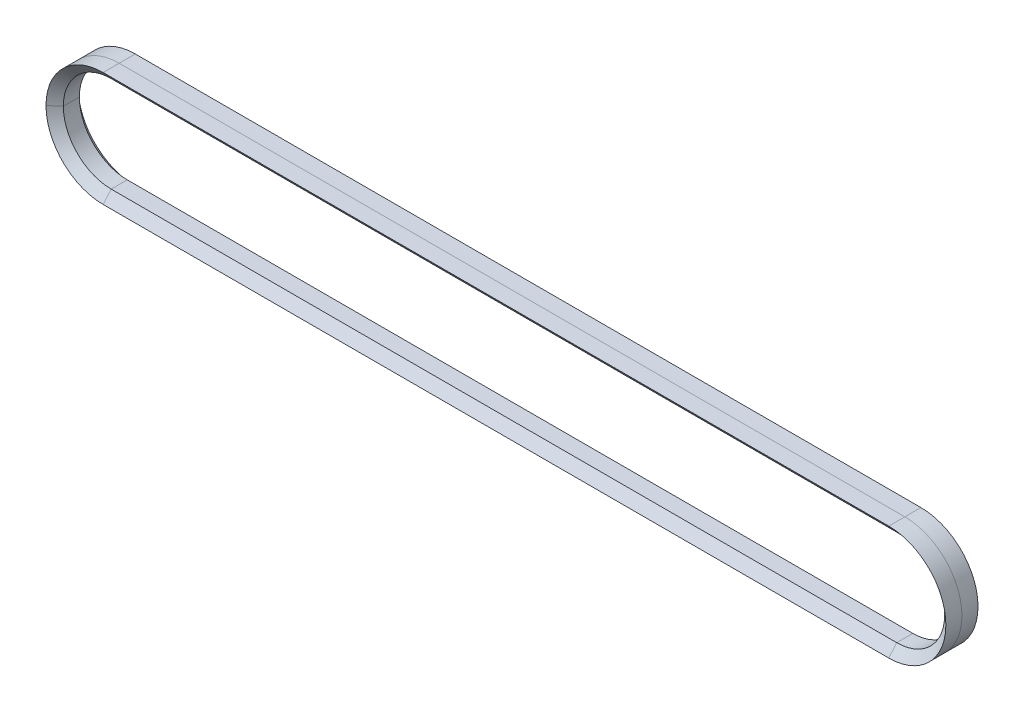
ISO-10303-21;
HEADER;
FILE_DESCRIPTION(('STEP AP214'),'2;1');
FILE_NAME('part.step','',(''),(''),'','','');
FILE_SCHEMA(('AUTOMOTIVE_DESIGN { 1 0 10303 214 1 1 1 1 }'));
ENDSEC;
DATA;
#1=APPLICATION_CONTEXT('core data for automotive mechanical design processes');
#2=APPLICATION_PROTOCOL_DEFINITION('international standard','automotive_design',2000,#1);
#3=PRODUCT_CONTEXT('',#1,'mechanical');
#4=PRODUCT('Part','Part','',(#3));
#5=PRODUCT_RELATED_PRODUCT_CATEGORY('part','',(#4));
#6=PRODUCT_DEFINITION_FORMATION('','',#4);
#7=PRODUCT_DEFINITION_CONTEXT('part definition',#1,'design');
#8=PRODUCT_DEFINITION('design','',#6,#7);
#9=PRODUCT_DEFINITION_SHAPE('','',#8);
#10=(LENGTH_UNIT() NAMED_UNIT(*) SI_UNIT(.MILLI.,.METRE.));
#11=(NAMED_UNIT(*) PLANE_ANGLE_UNIT() SI_UNIT($,.RADIAN.));
#12=(NAMED_UNIT(*) SI_UNIT($,.STERADIAN.) SOLID_ANGLE_UNIT());
#13=UNCERTAINTY_MEASURE_WITH_UNIT(LENGTH_MEASURE(1.E-05),#10,'distance_accuracy_value','');
#14=(GEOMETRIC_REPRESENTATION_CONTEXT(3) GLOBAL_UNCERTAINTY_ASSIGNED_CONTEXT((#13)) GLOBAL_UNIT_ASSIGNED_CONTEXT((#10,
#11,#12)) REPRESENTATION_CONTEXT('',''));
#15=CARTESIAN_POINT('',(0.,0.,0.));
#16=DIRECTION('',(0.,0.,1.));
#17=DIRECTION('',(1.,0.,0.));
#18=AXIS2_PLACEMENT_3D('',#15,#16,#17);
#19=CARTESIAN_POINT('',(-90.,0.,0.));
#20=DIRECTION('',(0.,0.,-1.));
#21=DIRECTION('',(-1.,0.,0.));
#22=AXIS2_PLACEMENT_3D('',#19,#20,#21);
#23=CYLINDRICAL_SURFACE('',#22,16.);
#24=CARTESIAN_POINT('',(-90.,0.,0.));
#25=DIRECTION('',(0.,0.,-1.));
#26=DIRECTION('',(0.,-1.,0.));
#27=AXIS2_PLACEMENT_3D('',#24,#25,#26);
#28=CIRCLE('',#27,16.);
#29=CARTESIAN_POINT('',(-90.,-15.9999999999999,0.));
#30=VERTEX_POINT('',#29);
#31=CARTESIAN_POINT('',(-106.,0.,0.));
#32=VERTEX_POINT('',#31);
#33=EDGE_CURVE('E11',#30,#32,#28,.T.);
#34=ORIENTED_EDGE('',*,*,#33,.F.);
#35=DIRECTION('',(0.,0.,1.));
#36=VECTOR('',#35,1.);
#37=CARTESIAN_POINT('',(-90.,-15.9999999999999,0.));
#38=LINE('',#37,#36);
#39=CARTESIAN_POINT('',(-90.,-15.9999999999999,4.5));
#40=VERTEX_POINT('',#39);
#41=EDGE_CURVE('E38',#30,#40,#38,.T.);
#42=ORIENTED_EDGE('',*,*,#41,.T.);
#43=CARTESIAN_POINT('',(-90.,0.,4.5));
#44=DIRECTION('',(0.,0.,-1.));
#45=DIRECTION('',(0.,-1.,0.));
#46=AXIS2_PLACEMENT_3D('',#43,#44,#45);
#47=CIRCLE('',#46,16.);
#48=CARTESIAN_POINT('',(-106.,0.,4.5));
#49=VERTEX_POINT('',#48);
#50=EDGE_CURVE('E153',#40,#49,#47,.T.);
#51=ORIENTED_EDGE('',*,*,#50,.T.);
#52=DIRECTION('',(0.,0.,1.));
#53=VECTOR('',#52,1.);
#54=CARTESIAN_POINT('',(-106.,0.,0.));
#55=LINE('',#54,#53);
#56=EDGE_CURVE('E156',#32,#49,#55,.T.);
#57=ORIENTED_EDGE('',*,*,#56,.F.);
#58=EDGE_LOOP('',(#34,#42,#51,#57));
#59=FACE_BOUND('',#58,.T.);
#60=ADVANCED_FACE('F35',(#59),#23,.T.);
#61=CARTESIAN_POINT('',(-90.,0.,0.));
#62=DIRECTION('',(0.,0.,-1.));
#63=DIRECTION('',(-1.,0.,0.));
#64=AXIS2_PLACEMENT_3D('',#61,#62,#63);
#65=CYLINDRICAL_SURFACE('',#64,16.);
#66=CARTESIAN_POINT('',(-90.,0.,-4.5));
#67=DIRECTION('',(0.,0.,-1.));
#68=DIRECTION('',(0.,-1.,0.));
#69=AXIS2_PLACEMENT_3D('',#66,#67,#68);
#70=CIRCLE('',#69,16.);
#71=CARTESIAN_POINT('',(-90.,-15.9999999999999,-4.5));
#72=VERTEX_POINT('',#71);
#73=CARTESIAN_POINT('',(-106.,0.,-4.5));
#74=VERTEX_POINT('',#73);
#75=EDGE_CURVE('E43',#72,#74,#70,.T.);
#76=ORIENTED_EDGE('',*,*,#75,.F.);
#77=DIRECTION('',(0.,0.,1.));
#78=VECTOR('',#77,1.);
#79=CARTESIAN_POINT('',(-90.,-15.9999999999999,0.));
#80=LINE('',#79,#78);
#81=EDGE_CURVE('E264',#72,#30,#80,.T.);
#82=ORIENTED_EDGE('',*,*,#81,.T.);
#83=ORIENTED_EDGE('',*,*,#33,.T.);
#84=DIRECTION('',(0.,0.,1.));
#85=VECTOR('',#84,1.);
#86=CARTESIAN_POINT('',(-106.,0.,0.));
#87=LINE('',#86,#85);
#88=EDGE_CURVE('E181',#74,#32,#87,.T.);
#89=ORIENTED_EDGE('',*,*,#88,.F.);
#90=EDGE_LOOP('',(#76,#82,#83,#89));
#91=FACE_BOUND('',#90,.T.);
#92=ADVANCED_FACE('F314',(#91),#65,.T.);
#93=CARTESIAN_POINT('',(-90.,0.,-2.25));
#94=DIRECTION('',(0.,0.,-1.));
#95=DIRECTION('',(-1.,0.,0.));
#96=AXIS2_PLACEMENT_3D('',#93,#94,#95);
#97=CONICAL_SURFACE('',#96,13.4,0.857438228784277);
#98=CARTESIAN_POINT('',(-90.,0.,-2.25));
#99=DIRECTION('',(0.,0.,-1.));
#100=DIRECTION('',(0.,-1.,0.));
#101=AXIS2_PLACEMENT_3D('',#98,#99,#100);
#102=CIRCLE('',#101,13.4);
#103=CARTESIAN_POINT('',(-90.,-13.3999999999999,-2.25));
#104=VERTEX_POINT('',#103);
#105=CARTESIAN_POINT('',(-103.4,0.,-2.25));
#106=VERTEX_POINT('',#105);
#107=EDGE_CURVE('E222',#104,#106,#102,.T.);
#108=ORIENTED_EDGE('',*,*,#107,.F.);
#109=DIRECTION('',(0.,-0.756168682462778,-0.654376744438941));
#110=VECTOR('',#109,1.);
#111=CARTESIAN_POINT('',(-90.,-15.9999999999999,-4.5));
#112=LINE('',#111,#110);
#113=EDGE_CURVE('E241',#104,#72,#112,.T.);
#114=ORIENTED_EDGE('',*,*,#113,.T.);
#115=ORIENTED_EDGE('',*,*,#75,.T.);
#116=DIRECTION('',(-0.756168682462778,0.,-0.654376744438941));
#117=VECTOR('',#116,1.);
#118=CARTESIAN_POINT('',(-106.,0.,-4.5));
#119=LINE('',#118,#117);
#120=EDGE_CURVE('E188',#106,#74,#119,.T.);
#121=ORIENTED_EDGE('',*,*,#120,.F.);
#122=EDGE_LOOP('',(#108,#114,#115,#121));
#123=FACE_BOUND('',#122,.T.);
#124=ADVANCED_FACE('F318',(#123),#97,.F.);
#125=CARTESIAN_POINT('',(-90.,0.,0.));
#126=DIRECTION('',(0.,0.,-1.));
#127=DIRECTION('',(-1.,0.,0.));
#128=AXIS2_PLACEMENT_3D('',#125,#126,#127);
#129=CYLINDRICAL_SURFACE('',#128,13.4);
#130=CARTESIAN_POINT('',(-90.,0.,2.25));
#131=DIRECTION('',(0.,0.,-1.));
#132=DIRECTION('',(0.,-1.,0.));
#133=AXIS2_PLACEMENT_3D('',#130,#131,#132);
#134=CIRCLE('',#133,13.4);
#135=CARTESIAN_POINT('',(-90.,-13.3999999999999,2.25));
#136=VERTEX_POINT('',#135);
#137=CARTESIAN_POINT('',(-103.4,0.,2.25));
#138=VERTEX_POINT('',#137);
#139=EDGE_CURVE('E162',#136,#138,#134,.T.);
#140=ORIENTED_EDGE('',*,*,#139,.F.);
#141=DIRECTION('',(0.,0.,-1.));
#142=VECTOR('',#141,1.);
#143=CARTESIAN_POINT('',(-90.,-13.3999999999999,-2.25));
#144=LINE('',#143,#142);
#145=EDGE_CURVE('E218',#136,#104,#144,.T.);
#146=ORIENTED_EDGE('',*,*,#145,.T.);
#147=ORIENTED_EDGE('',*,*,#107,.T.);
#148=DIRECTION('',(0.,0.,-1.));
#149=VECTOR('',#148,1.);
#150=CARTESIAN_POINT('',(-103.4,0.,-2.25));
#151=LINE('',#150,#149);
#152=EDGE_CURVE('E185',#138,#106,#151,.T.);
#153=ORIENTED_EDGE('',*,*,#152,.F.);
#154=EDGE_LOOP('',(#140,#146,#147,#153));
#155=FACE_BOUND('',#154,.T.);
#156=ADVANCED_FACE('F323',(#155),#129,.F.);
#157=CARTESIAN_POINT('',(130.,-16.,0.));
#158=DIRECTION('',(0.,-1.,0.));
#159=DIRECTION('',(1.,0.,0.));
#160=AXIS2_PLACEMENT_3D('',#157,#158,#159);
#161=PLANE('',#160);
#162=ORIENTED_EDGE('',*,*,#41,.F.);
#163=DIRECTION('',(-1.,0.,0.));
#164=VECTOR('',#163,1.);
#165=CARTESIAN_POINT('',(130.,-16.,0.));
#166=LINE('',#165,#164);
#167=CARTESIAN_POINT('',(130.,-16.,0.));
#168=VERTEX_POINT('',#167);
#169=EDGE_CURVE('E278',#168,#30,#166,.T.);
#170=ORIENTED_EDGE('',*,*,#169,.F.);
#171=DIRECTION('',(0.,0.,1.));
#172=VECTOR('',#171,1.);
#173=CARTESIAN_POINT('',(130.,-16.,0.));
#174=LINE('',#173,#172);
#175=CARTESIAN_POINT('',(130.,-16.,4.5));
#176=VERTEX_POINT('',#175);
#177=EDGE_CURVE('E221',#168,#176,#174,.T.);
#178=ORIENTED_EDGE('',*,*,#177,.T.);
#179=DIRECTION('',(-1.,0.,0.));
#180=VECTOR('',#179,1.);
#181=CARTESIAN_POINT('',(130.,-16.,4.5));
#182=LINE('',#181,#180);
#183=EDGE_CURVE('E215',#176,#40,#182,.T.);
#184=ORIENTED_EDGE('',*,*,#183,.T.);
#185=EDGE_LOOP('',(#162,#170,#178,#184));
#186=FACE_BOUND('',#185,.T.);
#187=ADVANCED_FACE('F288',(#186),#161,.T.);
#188=CARTESIAN_POINT('',(130.,-16.,0.));
#189=DIRECTION('',(0.,-1.,0.));
#190=DIRECTION('',(1.,0.,0.));
#191=AXIS2_PLACEMENT_3D('',#188,#189,#190);
#192=PLANE('',#191);
#193=ORIENTED_EDGE('',*,*,#169,.T.);
#194=ORIENTED_EDGE('',*,*,#81,.F.);
#195=DIRECTION('',(-1.,0.,0.));
#196=VECTOR('',#195,1.);
#197=CARTESIAN_POINT('',(130.,-16.,-4.5));
#198=LINE('',#197,#196);
#199=CARTESIAN_POINT('',(130.,-16.,-4.5));
#200=VERTEX_POINT('',#199);
#201=EDGE_CURVE('E261',#200,#72,#198,.T.);
#202=ORIENTED_EDGE('',*,*,#201,.F.);
#203=DIRECTION('',(0.,0.,1.));
#204=VECTOR('',#203,1.);
#205=CARTESIAN_POINT('',(130.,-16.,0.));
#206=LINE('',#205,#204);
#207=EDGE_CURVE('E257',#200,#168,#206,.T.);
#208=ORIENTED_EDGE('',*,*,#207,.T.);
#209=EDGE_LOOP('',(#193,#194,#202,#208));
#210=FACE_BOUND('',#209,.T.);
#211=ADVANCED_FACE('F328',(#210),#192,.T.);
#212=CARTESIAN_POINT('',(130.,-16.,-4.5));
#213=DIRECTION('',(0.,0.654376744438941,-0.756168682462778));
#214=DIRECTION('',(0.,0.756168682462778,0.654376744438941));
#215=AXIS2_PLACEMENT_3D('',#212,#213,#214);
#216=PLANE('',#215);
#217=ORIENTED_EDGE('',*,*,#201,.T.);
#218=ORIENTED_EDGE('',*,*,#113,.F.);
#219=DIRECTION('',(-1.,0.,0.));
#220=VECTOR('',#219,1.);
#221=CARTESIAN_POINT('',(130.,-13.4,-2.25));
#222=LINE('',#221,#220);
#223=CARTESIAN_POINT('',(130.,-13.4,-2.25));
#224=VERTEX_POINT('',#223);
#225=EDGE_CURVE('E238',#224,#104,#222,.T.);
#226=ORIENTED_EDGE('',*,*,#225,.F.);
#227=DIRECTION('',(0.,-0.756168682462778,-0.654376744438941));
#228=VECTOR('',#227,1.);
#229=CARTESIAN_POINT('',(130.,-16.,-4.5));
#230=LINE('',#229,#228);
#231=EDGE_CURVE('E234',#224,#200,#230,.T.);
#232=ORIENTED_EDGE('',*,*,#231,.T.);
#233=EDGE_LOOP('',(#217,#218,#226,#232));
#234=FACE_BOUND('',#233,.T.);
#235=ADVANCED_FACE('F345',(#234),#216,.T.);
#236=CARTESIAN_POINT('',(130.,-13.4,-2.25));
#237=DIRECTION('',(0.,1.,0.));
#238=DIRECTION('',(-1.,0.,0.));
#239=AXIS2_PLACEMENT_3D('',#236,#237,#238);
#240=PLANE('',#239);
#241=ORIENTED_EDGE('',*,*,#225,.T.);
#242=ORIENTED_EDGE('',*,*,#145,.F.);
#243=DIRECTION('',(-1.,0.,0.));
#244=VECTOR('',#243,1.);
#245=CARTESIAN_POINT('',(130.,-13.4,2.25));
#246=LINE('',#245,#244);
#247=CARTESIAN_POINT('',(130.,-13.4,2.25));
#248=VERTEX_POINT('',#247);
#249=EDGE_CURVE('E214',#248,#136,#246,.T.);
#250=ORIENTED_EDGE('',*,*,#249,.F.);
#251=DIRECTION('',(0.,0.,-1.));
#252=VECTOR('',#251,1.);
#253=CARTESIAN_POINT('',(130.,-13.4,-2.25));
#254=LINE('',#253,#252);
#255=EDGE_CURVE('E207',#248,#224,#254,.T.);
#256=ORIENTED_EDGE('',*,*,#255,.T.);
#257=EDGE_LOOP('',(#241,#242,#250,#256));
#258=FACE_BOUND('',#257,.T.);
#259=ADVANCED_FACE('F298',(#258),#240,.T.);
#260=CARTESIAN_POINT('',(130.,-13.4,2.25));
#261=DIRECTION('',(0.,0.654376744438941,0.756168682462778));
#262=DIRECTION('',(0.,-0.756168682462778,0.654376744438941));
#263=AXIS2_PLACEMENT_3D('',#260,#261,#262);
#264=PLANE('',#263);
#265=ORIENTED_EDGE('',*,*,#249,.T.);
#266=DIRECTION('',(0.,0.756168682462778,-0.654376744438941));
#267=VECTOR('',#266,1.);
#268=CARTESIAN_POINT('',(-90.,-13.3999999999999,2.25));
#269=LINE('',#268,#267);
#270=EDGE_CURVE('E212',#40,#136,#269,.T.);
#271=ORIENTED_EDGE('',*,*,#270,.F.);
#272=ORIENTED_EDGE('',*,*,#183,.F.);
#273=DIRECTION('',(0.,0.756168682462778,-0.654376744438941));
#274=VECTOR('',#273,1.);
#275=CARTESIAN_POINT('',(130.,-13.4,2.25));
#276=LINE('',#275,#274);
#277=EDGE_CURVE('E204',#176,#248,#276,.T.);
#278=ORIENTED_EDGE('',*,*,#277,.T.);
#279=EDGE_LOOP('',(#265,#271,#272,#278));
#280=FACE_BOUND('',#279,.T.);
#281=ADVANCED_FACE('F295',(#280),#264,.T.);
#282=CARTESIAN_POINT('',(130.,0.,0.));
#283=DIRECTION('',(0.,0.,-1.));
#284=DIRECTION('',(-1.,0.,0.));
#285=AXIS2_PLACEMENT_3D('',#282,#283,#284);
#286=CYLINDRICAL_SURFACE('',#285,16.);
#287=ORIENTED_EDGE('',*,*,#177,.F.);
#288=CARTESIAN_POINT('',(130.,0.,0.));
#289=DIRECTION('',(0.,0.,-1.));
#290=DIRECTION('',(0.,1.,0.));
#291=AXIS2_PLACEMENT_3D('',#288,#289,#290);
#292=CIRCLE('',#291,16.);
#293=CARTESIAN_POINT('',(130.,16.,0.));
#294=VERTEX_POINT('',#293);
#295=EDGE_CURVE('E85',#294,#168,#292,.T.);
#296=ORIENTED_EDGE('',*,*,#295,.F.);
#297=DIRECTION('',(0.,0.,1.));
#298=VECTOR('',#297,1.);
#299=CARTESIAN_POINT('',(130.,16.,0.));
#300=LINE('',#299,#298);
#301=CARTESIAN_POINT('',(130.,16.,4.5));
#302=VERTEX_POINT('',#301);
#303=EDGE_CURVE('E211',#294,#302,#300,.T.);
#304=ORIENTED_EDGE('',*,*,#303,.T.);
#305=CARTESIAN_POINT('',(130.,0.,4.5));
#306=DIRECTION('',(0.,0.,-1.));
#307=DIRECTION('',(0.,1.,0.));
#308=AXIS2_PLACEMENT_3D('',#305,#306,#307);
#309=CIRCLE('',#308,16.);
#310=EDGE_CURVE('E209',#302,#176,#309,.T.);
#311=ORIENTED_EDGE('',*,*,#310,.T.);
#312=EDGE_LOOP('',(#287,#296,#304,#311));
#313=FACE_BOUND('',#312,.T.);
#314=ADVANCED_FACE('F338',(#313),#286,.T.);
#315=CARTESIAN_POINT('',(130.,0.,0.));
#316=DIRECTION('',(0.,0.,-1.));
#317=DIRECTION('',(-1.,0.,0.));
#318=AXIS2_PLACEMENT_3D('',#315,#316,#317);
#319=CYLINDRICAL_SURFACE('',#318,16.);
#320=ORIENTED_EDGE('',*,*,#295,.T.);
#321=ORIENTED_EDGE('',*,*,#207,.F.);
#322=CARTESIAN_POINT('',(130.,0.,-4.5));
#323=DIRECTION('',(0.,0.,-1.));
#324=DIRECTION('',(0.,1.,0.));
#325=AXIS2_PLACEMENT_3D('',#322,#323,#324);
#326=CIRCLE('',#325,16.);
#327=CARTESIAN_POINT('',(130.,16.,-4.5));
#328=VERTEX_POINT('',#327);
#329=EDGE_CURVE('E95',#328,#200,#326,.T.);
#330=ORIENTED_EDGE('',*,*,#329,.F.);
#331=DIRECTION('',(0.,0.,1.));
#332=VECTOR('',#331,1.);
#333=CARTESIAN_POINT('',(130.,16.,0.));
#334=LINE('',#333,#332);
#335=EDGE_CURVE('E254',#328,#294,#334,.T.);
#336=ORIENTED_EDGE('',*,*,#335,.T.);
#337=EDGE_LOOP('',(#320,#321,#330,#336));
#338=FACE_BOUND('',#337,.T.);
#339=ADVANCED_FACE('F309',(#338),#319,.T.);
#340=CARTESIAN_POINT('',(130.,0.,-2.25));
#341=DIRECTION('',(0.,0.,-1.));
#342=DIRECTION('',(-1.,0.,0.));
#343=AXIS2_PLACEMENT_3D('',#340,#341,#342);
#344=CONICAL_SURFACE('',#343,13.4,0.857438228784277);
#345=ORIENTED_EDGE('',*,*,#329,.T.);
#346=ORIENTED_EDGE('',*,*,#231,.F.);
#347=CARTESIAN_POINT('',(130.,0.,-2.25));
#348=DIRECTION('',(0.,0.,-1.));
#349=DIRECTION('',(0.,1.,0.));
#350=AXIS2_PLACEMENT_3D('',#347,#348,#349);
#351=CIRCLE('',#350,13.4);
#352=CARTESIAN_POINT('',(130.,13.4,-2.25));
#353=VERTEX_POINT('',#352);
#354=EDGE_CURVE('E104',#353,#224,#351,.T.);
#355=ORIENTED_EDGE('',*,*,#354,.F.);
#356=DIRECTION('',(0.,0.756168682462778,-0.654376744438941));
#357=VECTOR('',#356,1.);
#358=CARTESIAN_POINT('',(130.,16.,-4.5));
#359=LINE('',#358,#357);
#360=EDGE_CURVE('E231',#353,#328,#359,.T.);
#361=ORIENTED_EDGE('',*,*,#360,.T.);
#362=EDGE_LOOP('',(#345,#346,#355,#361));
#363=FACE_BOUND('',#362,.T.);
#364=ADVANCED_FACE('F301',(#363),#344,.F.);
#365=CARTESIAN_POINT('',(130.,0.,0.));
#366=DIRECTION('',(0.,0.,-1.));
#367=DIRECTION('',(-1.,0.,0.));
#368=AXIS2_PLACEMENT_3D('',#365,#366,#367);
#369=CYLINDRICAL_SURFACE('',#368,13.4);
#370=ORIENTED_EDGE('',*,*,#354,.T.);
#371=ORIENTED_EDGE('',*,*,#255,.F.);
#372=CARTESIAN_POINT('',(130.,0.,2.25));
#373=DIRECTION('',(0.,0.,-1.));
#374=DIRECTION('',(0.,1.,0.));
#375=AXIS2_PLACEMENT_3D('',#372,#373,#374);
#376=CIRCLE('',#375,13.4);
#377=CARTESIAN_POINT('',(130.,13.4,2.25));
#378=VERTEX_POINT('',#377);
#379=EDGE_CURVE('E121',#378,#248,#376,.T.);
#380=ORIENTED_EDGE('',*,*,#379,.F.);
#381=DIRECTION('',(0.,0.,-1.));
#382=VECTOR('',#381,1.);
#383=CARTESIAN_POINT('',(130.,13.4,-2.25));
#384=LINE('',#383,#382);
#385=EDGE_CURVE('E200',#378,#353,#384,.T.);
#386=ORIENTED_EDGE('',*,*,#385,.T.);
#387=EDGE_LOOP('',(#370,#371,#380,#386));
#388=FACE_BOUND('',#387,.T.);
#389=ADVANCED_FACE('F299',(#388),#369,.F.);
#390=CARTESIAN_POINT('',(130.,0.,4.5));
#391=DIRECTION('',(0.,0.,1.));
#392=DIRECTION('',(1.,0.,0.));
#393=AXIS2_PLACEMENT_3D('',#390,#391,#392);
#394=CONICAL_SURFACE('',#393,16.,0.857438228784277);
#395=ORIENTED_EDGE('',*,*,#379,.T.);
#396=ORIENTED_EDGE('',*,*,#277,.F.);
#397=ORIENTED_EDGE('',*,*,#310,.F.);
#398=DIRECTION('',(0.,-0.756168682462778,-0.654376744438941));
#399=VECTOR('',#398,1.);
#400=CARTESIAN_POINT('',(130.,13.4,2.25));
#401=LINE('',#400,#399);
#402=EDGE_CURVE('E195',#302,#378,#401,.T.);
#403=ORIENTED_EDGE('',*,*,#402,.T.);
#404=EDGE_LOOP('',(#395,#396,#397,#403));
#405=FACE_BOUND('',#404,.T.);
#406=ADVANCED_FACE('F292',(#405),#394,.F.);
#407=CARTESIAN_POINT('',(-90.0000000000001,16.,0.));
#408=DIRECTION('',(0.,1.,0.));
#409=DIRECTION('',(-1.,0.,0.));
#410=AXIS2_PLACEMENT_3D('',#407,#408,#409);
#411=PLANE('',#410);
#412=ORIENTED_EDGE('',*,*,#303,.F.);
#413=DIRECTION('',(1.,0.,0.));
#414=VECTOR('',#413,1.);
#415=CARTESIAN_POINT('',(-90.0000000000001,16.,0.));
#416=LINE('',#415,#414);
#417=CARTESIAN_POINT('',(-90.0000000000001,16.,0.));
#418=VERTEX_POINT('',#417);
#419=EDGE_CURVE('E271',#418,#294,#416,.T.);
#420=ORIENTED_EDGE('',*,*,#419,.F.);
#421=DIRECTION('',(0.,0.,1.));
#422=VECTOR('',#421,1.);
#423=CARTESIAN_POINT('',(-90.0000000000001,16.,0.));
#424=LINE('',#423,#422);
#425=CARTESIAN_POINT('',(-90.0000000000001,16.,4.5));
#426=VERTEX_POINT('',#425);
#427=EDGE_CURVE('E203',#418,#426,#424,.T.);
#428=ORIENTED_EDGE('',*,*,#427,.T.);
#429=DIRECTION('',(1.,0.,0.));
#430=VECTOR('',#429,1.);
#431=CARTESIAN_POINT('',(-90.0000000000001,16.,4.5));
#432=LINE('',#431,#430);
#433=EDGE_CURVE('E198',#426,#302,#432,.T.);
#434=ORIENTED_EDGE('',*,*,#433,.T.);
#435=EDGE_LOOP('',(#412,#420,#428,#434));
#436=FACE_BOUND('',#435,.T.);
#437=ADVANCED_FACE('F307',(#436),#411,.T.);
#438=CARTESIAN_POINT('',(-90.0000000000001,16.,0.));
#439=DIRECTION('',(0.,1.,0.));
#440=DIRECTION('',(-1.,0.,0.));
#441=AXIS2_PLACEMENT_3D('',#438,#439,#440);
#442=PLANE('',#441);
#443=ORIENTED_EDGE('',*,*,#419,.T.);
#444=ORIENTED_EDGE('',*,*,#335,.F.);
#445=DIRECTION('',(1.,0.,0.));
#446=VECTOR('',#445,1.);
#447=CARTESIAN_POINT('',(-90.0000000000001,16.,-4.5));
#448=LINE('',#447,#446);
#449=CARTESIAN_POINT('',(-90.0000000000001,16.,-4.5));
#450=VERTEX_POINT('',#449);
#451=EDGE_CURVE('E251',#450,#328,#448,.T.);
#452=ORIENTED_EDGE('',*,*,#451,.F.);
#453=DIRECTION('',(0.,0.,1.));
#454=VECTOR('',#453,1.);
#455=CARTESIAN_POINT('',(-90.0000000000001,16.,0.));
#456=LINE('',#455,#454);
#457=EDGE_CURVE('E249',#450,#418,#456,.T.);
#458=ORIENTED_EDGE('',*,*,#457,.T.);
#459=EDGE_LOOP('',(#443,#444,#452,#458));
#460=FACE_BOUND('',#459,.T.);
#461=ADVANCED_FACE('F336',(#460),#442,.T.);
#462=CARTESIAN_POINT('',(-90.0000000000001,16.,-4.5));
#463=DIRECTION('',(0.,-0.654376744438941,-0.756168682462778));
#464=DIRECTION('',(0.,0.756168682462778,-0.654376744438941));
#465=AXIS2_PLACEMENT_3D('',#462,#463,#464);
#466=PLANE('',#465);
#467=ORIENTED_EDGE('',*,*,#451,.T.);
#468=ORIENTED_EDGE('',*,*,#360,.F.);
#469=DIRECTION('',(1.,0.,0.));
#470=VECTOR('',#469,1.);
#471=CARTESIAN_POINT('',(-90.0000000000001,13.4,-2.25));
#472=LINE('',#471,#470);
#473=CARTESIAN_POINT('',(-90.0000000000001,13.4,-2.25));
#474=VERTEX_POINT('',#473);
#475=EDGE_CURVE('E138',#474,#353,#472,.T.);
#476=ORIENTED_EDGE('',*,*,#475,.F.);
#477=DIRECTION('',(0.,0.756168682462778,-0.654376744438941));
#478=VECTOR('',#477,1.);
#479=CARTESIAN_POINT('',(-90.0000000000001,16.,-4.5));
#480=LINE('',#479,#478);
#481=EDGE_CURVE('E228',#474,#450,#480,.T.);
#482=ORIENTED_EDGE('',*,*,#481,.T.);
#483=EDGE_LOOP('',(#467,#468,#476,#482));
#484=FACE_BOUND('',#483,.T.);
#485=ADVANCED_FACE('F357',(#484),#466,.T.);
#486=CARTESIAN_POINT('',(-90.0000000000001,13.4,-2.25));
#487=DIRECTION('',(0.,-1.,0.));
#488=DIRECTION('',(1.,0.,0.));
#489=AXIS2_PLACEMENT_3D('',#486,#487,#488);
#490=PLANE('',#489);
#491=ORIENTED_EDGE('',*,*,#475,.T.);
#492=ORIENTED_EDGE('',*,*,#385,.F.);
#493=DIRECTION('',(1.,0.,0.));
#494=VECTOR('',#493,1.);
#495=CARTESIAN_POINT('',(-90.0000000000001,13.4,2.25));
#496=LINE('',#495,#494);
#497=CARTESIAN_POINT('',(-90.0000000000001,13.4,2.25));
#498=VERTEX_POINT('',#497);
#499=EDGE_CURVE('E144',#498,#378,#496,.T.);
#500=ORIENTED_EDGE('',*,*,#499,.F.);
#501=DIRECTION('',(0.,0.,-1.));
#502=VECTOR('',#501,1.);
#503=CARTESIAN_POINT('',(-90.0000000000001,13.4,-2.25));
#504=LINE('',#503,#502);
#505=EDGE_CURVE('E193',#498,#474,#504,.T.);
#506=ORIENTED_EDGE('',*,*,#505,.T.);
#507=EDGE_LOOP('',(#491,#492,#500,#506));
#508=FACE_BOUND('',#507,.T.);
#509=ADVANCED_FACE('F359',(#508),#490,.T.);
#510=CARTESIAN_POINT('',(-90.0000000000001,13.4,2.25));
#511=DIRECTION('',(0.,-0.654376744438941,0.756168682462778));
#512=DIRECTION('',(0.,-0.756168682462778,-0.654376744438941));
#513=AXIS2_PLACEMENT_3D('',#510,#511,#512);
#514=PLANE('',#513);
#515=ORIENTED_EDGE('',*,*,#499,.T.);
#516=ORIENTED_EDGE('',*,*,#402,.F.);
#517=ORIENTED_EDGE('',*,*,#433,.F.);
#518=DIRECTION('',(0.,-0.756168682462778,-0.654376744438941));
#519=VECTOR('',#518,1.);
#520=CARTESIAN_POINT('',(-90.0000000000001,13.4,2.25));
#521=LINE('',#520,#519);
#522=EDGE_CURVE('E173',#426,#498,#521,.T.);
#523=ORIENTED_EDGE('',*,*,#522,.T.);
#524=EDGE_LOOP('',(#515,#516,#517,#523));
#525=FACE_BOUND('',#524,.T.);
#526=ADVANCED_FACE('F333',(#525),#514,.T.);
#527=CARTESIAN_POINT('',(-90.,0.,0.));
#528=DIRECTION('',(0.,0.,-1.));
#529=DIRECTION('',(-1.,0.,0.));
#530=AXIS2_PLACEMENT_3D('',#527,#528,#529);
#531=CYLINDRICAL_SURFACE('',#530,16.);
#532=ORIENTED_EDGE('',*,*,#427,.F.);
#533=CARTESIAN_POINT('',(-90.,0.,0.));
#534=DIRECTION('',(0.,0.,-1.));
#535=DIRECTION('',(-1.,0.,0.));
#536=AXIS2_PLACEMENT_3D('',#533,#534,#535);
#537=CIRCLE('',#536,16.);
#538=EDGE_CURVE('E180',#32,#418,#537,.T.);
#539=ORIENTED_EDGE('',*,*,#538,.F.);
#540=ORIENTED_EDGE('',*,*,#56,.T.);
#541=CARTESIAN_POINT('',(-90.,0.,4.5));
#542=DIRECTION('',(0.,0.,-1.));
#543=DIRECTION('',(-1.,0.,0.));
#544=AXIS2_PLACEMENT_3D('',#541,#542,#543);
#545=CIRCLE('',#544,16.);
#546=EDGE_CURVE('E168',#49,#426,#545,.T.);
#547=ORIENTED_EDGE('',*,*,#546,.T.);
#548=EDGE_LOOP('',(#532,#539,#540,#547));
#549=FACE_BOUND('',#548,.T.);
#550=ADVANCED_FACE('F178',(#549),#531,.T.);
#551=CARTESIAN_POINT('',(-90.,0.,0.));
#552=DIRECTION('',(0.,0.,-1.));
#553=DIRECTION('',(-1.,0.,0.));
#554=AXIS2_PLACEMENT_3D('',#551,#552,#553);
#555=CYLINDRICAL_SURFACE('',#554,16.);
#556=ORIENTED_EDGE('',*,*,#538,.T.);
#557=ORIENTED_EDGE('',*,*,#457,.F.);
#558=CARTESIAN_POINT('',(-90.,0.,-4.5));
#559=DIRECTION('',(0.,0.,-1.));
#560=DIRECTION('',(-1.,0.,0.));
#561=AXIS2_PLACEMENT_3D('',#558,#559,#560);
#562=CIRCLE('',#561,16.);
#563=EDGE_CURVE('E246',#74,#450,#562,.T.);
#564=ORIENTED_EDGE('',*,*,#563,.F.);
#565=ORIENTED_EDGE('',*,*,#88,.T.);
#566=EDGE_LOOP('',(#556,#557,#564,#565));
#567=FACE_BOUND('',#566,.T.);
#568=ADVANCED_FACE('F332',(#567),#555,.T.);
#569=CARTESIAN_POINT('',(-90.,0.,-2.25));
#570=DIRECTION('',(0.,0.,-1.));
#571=DIRECTION('',(-1.,0.,0.));
#572=AXIS2_PLACEMENT_3D('',#569,#570,#571);
#573=CONICAL_SURFACE('',#572,13.4,0.857438228784277);
#574=ORIENTED_EDGE('',*,*,#563,.T.);
#575=ORIENTED_EDGE('',*,*,#481,.F.);
#576=CARTESIAN_POINT('',(-90.,0.,-2.25));
#577=DIRECTION('',(0.,0.,-1.));
#578=DIRECTION('',(-1.,0.,0.));
#579=AXIS2_PLACEMENT_3D('',#576,#577,#578);
#580=CIRCLE('',#579,13.4);
#581=EDGE_CURVE('E225',#106,#474,#580,.T.);
#582=ORIENTED_EDGE('',*,*,#581,.F.);
#583=ORIENTED_EDGE('',*,*,#120,.T.);
#584=EDGE_LOOP('',(#574,#575,#582,#583));
#585=FACE_BOUND('',#584,.T.);
#586=ADVANCED_FACE('F352',(#585),#573,.F.);
#587=CARTESIAN_POINT('',(-90.,0.,0.));
#588=DIRECTION('',(0.,0.,-1.));
#589=DIRECTION('',(-1.,0.,0.));
#590=AXIS2_PLACEMENT_3D('',#587,#588,#589);
#591=CYLINDRICAL_SURFACE('',#590,13.4);
#592=ORIENTED_EDGE('',*,*,#581,.T.);
#593=ORIENTED_EDGE('',*,*,#505,.F.);
#594=CARTESIAN_POINT('',(-90.,0.,2.25));
#595=DIRECTION('',(0.,0.,-1.));
#596=DIRECTION('',(-1.,0.,0.));
#597=AXIS2_PLACEMENT_3D('',#594,#595,#596);
#598=CIRCLE('',#597,13.4);
#599=EDGE_CURVE('E192',#138,#498,#598,.T.);
#600=ORIENTED_EDGE('',*,*,#599,.F.);
#601=ORIENTED_EDGE('',*,*,#152,.T.);
#602=EDGE_LOOP('',(#592,#593,#600,#601));
#603=FACE_BOUND('',#602,.T.);
#604=ADVANCED_FACE('F355',(#603),#591,.F.);
#605=CARTESIAN_POINT('',(-90.,0.,4.5));
#606=DIRECTION('',(0.,0.,1.));
#607=DIRECTION('',(1.,0.,0.));
#608=AXIS2_PLACEMENT_3D('',#605,#606,#607);
#609=CONICAL_SURFACE('',#608,16.,0.857438228784277);
#610=ORIENTED_EDGE('',*,*,#599,.T.);
#611=ORIENTED_EDGE('',*,*,#522,.F.);
#612=ORIENTED_EDGE('',*,*,#546,.F.);
#613=DIRECTION('',(0.756168682462778,0.,-0.654376744438941));
#614=VECTOR('',#613,1.);
#615=CARTESIAN_POINT('',(-103.4,0.,2.25));
#616=LINE('',#615,#614);
#617=EDGE_CURVE('E171',#49,#138,#616,.T.);
#618=ORIENTED_EDGE('',*,*,#617,.T.);
#619=EDGE_LOOP('',(#610,#611,#612,#618));
#620=FACE_BOUND('',#619,.T.);
#621=ADVANCED_FACE('F170',(#620),#609,.F.);
#622=CARTESIAN_POINT('',(-90.,0.,4.5));
#623=DIRECTION('',(0.,0.,1.));
#624=DIRECTION('',(1.,0.,0.));
#625=AXIS2_PLACEMENT_3D('',#622,#623,#624);
#626=CONICAL_SURFACE('',#625,16.,0.857438228784277);
#627=ORIENTED_EDGE('',*,*,#270,.T.);
#628=ORIENTED_EDGE('',*,*,#139,.T.);
#629=ORIENTED_EDGE('',*,*,#617,.F.);
#630=ORIENTED_EDGE('',*,*,#50,.F.);
#631=EDGE_LOOP('',(#627,#628,#629,#630));
#632=FACE_BOUND('',#631,.T.);
#633=ADVANCED_FACE('F183',(#632),#626,.F.);
#634=CLOSED_SHELL('',(#60,#92,#124,#156,#187,#211,#235,#259,#281,#314,#339,#364,#389,#406,#437,
#461,#485,#509,#526,#550,#568,#586,#604,#621,#633));
#635=MANIFOLD_SOLID_BREP('B2',#634);
#636=ADVANCED_BREP_SHAPE_REPRESENTATION('',(#18,#635),#14);
#637=SHAPE_DEFINITION_REPRESENTATION(#9,#636);
ENDSEC;
END-ISO-10303-21;
